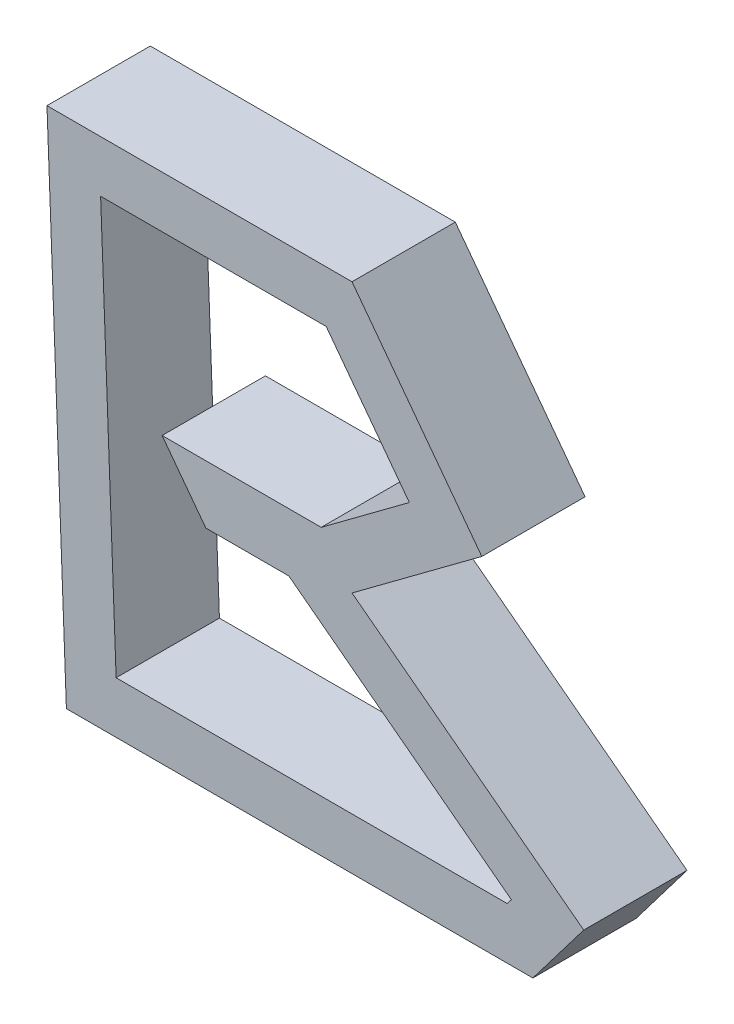
ISO-10303-21;
HEADER;
FILE_DESCRIPTION(('STEP AP214'),'2;1');
FILE_NAME('part.step','',(''),(''),'','','');
FILE_SCHEMA(('AUTOMOTIVE_DESIGN { 1 0 10303 214 1 1 1 1 }'));
ENDSEC;
DATA;
#1=APPLICATION_CONTEXT('core data for automotive mechanical design processes');
#2=APPLICATION_PROTOCOL_DEFINITION('international standard','automotive_design',2000,#1);
#3=PRODUCT_CONTEXT('',#1,'mechanical');
#4=PRODUCT('Part','Part','',(#3));
#5=PRODUCT_RELATED_PRODUCT_CATEGORY('part','',(#4));
#6=PRODUCT_DEFINITION_FORMATION('','',#4);
#7=PRODUCT_DEFINITION_CONTEXT('part definition',#1,'design');
#8=PRODUCT_DEFINITION('design','',#6,#7);
#9=PRODUCT_DEFINITION_SHAPE('','',#8);
#10=(LENGTH_UNIT() NAMED_UNIT(*) SI_UNIT(.MILLI.,.METRE.));
#11=(NAMED_UNIT(*) PLANE_ANGLE_UNIT() SI_UNIT($,.RADIAN.));
#12=(NAMED_UNIT(*) SI_UNIT($,.STERADIAN.) SOLID_ANGLE_UNIT());
#13=UNCERTAINTY_MEASURE_WITH_UNIT(LENGTH_MEASURE(1.E-05),#10,'distance_accuracy_value','');
#14=(GEOMETRIC_REPRESENTATION_CONTEXT(3) GLOBAL_UNCERTAINTY_ASSIGNED_CONTEXT((#13)) GLOBAL_UNIT_ASSIGNED_CONTEXT((#10,
#11,#12)) REPRESENTATION_CONTEXT('',''));
#15=CARTESIAN_POINT('',(0.,0.,0.));
#16=DIRECTION('',(0.,0.,1.));
#17=DIRECTION('',(1.,0.,0.));
#18=AXIS2_PLACEMENT_3D('',#15,#16,#17);
#19=CARTESIAN_POINT('',(-32.5757575757575,-52.9040404040404,20.));
#20=DIRECTION('',(-0.999283369789429,-0.0378516427950544,0.));
#21=DIRECTION('',(0.0378516427950544,-0.999283369789429,0.));
#22=AXIS2_PLACEMENT_3D('',#19,#20,#21);
#23=PLANE('',#22);
#24=DIRECTION('',(-0.0378516427950544,0.999283369789429,0.));
#25=VECTOR('',#24,1.);
#26=CARTESIAN_POINT('',(-32.5757575757575,-52.9040404040404,0.));
#27=LINE('',#26,#25);
#28=CARTESIAN_POINT('',(-32.5757575757575,-52.9040404040404,0.));
#29=VERTEX_POINT('',#28);
#30=CARTESIAN_POINT('',(-36.334940312213,46.3383838383838,0.));
#31=VERTEX_POINT('',#30);
#32=EDGE_CURVE('E221',#29,#31,#27,.T.);
#33=ORIENTED_EDGE('',*,*,#32,.F.);
#34=DIRECTION('',(0.,0.,-1.));
#35=VECTOR('',#34,1.);
#36=CARTESIAN_POINT('',(-32.5757575757575,-52.9040404040404,20.));
#37=LINE('',#36,#35);
#38=CARTESIAN_POINT('',(-32.5757575757575,-52.9040404040404,20.));
#39=VERTEX_POINT('',#38);
#40=EDGE_CURVE('E11',#39,#29,#37,.T.);
#41=ORIENTED_EDGE('',*,*,#40,.F.);
#42=DIRECTION('',(-0.0378516427950544,0.999283369789429,0.));
#43=VECTOR('',#42,1.);
#44=CARTESIAN_POINT('',(-32.5757575757575,-52.9040404040404,20.));
#45=LINE('',#44,#43);
#46=CARTESIAN_POINT('',(-36.334940312213,46.3383838383838,20.));
#47=VERTEX_POINT('',#46);
#48=EDGE_CURVE('E237',#39,#47,#45,.T.);
#49=ORIENTED_EDGE('',*,*,#48,.T.);
#50=DIRECTION('',(0.,0.,-1.));
#51=VECTOR('',#50,1.);
#52=CARTESIAN_POINT('',(-36.334940312213,46.3383838383838,20.));
#53=LINE('',#52,#51);
#54=EDGE_CURVE('E36',#47,#31,#53,.T.);
#55=ORIENTED_EDGE('',*,*,#54,.T.);
#56=EDGE_LOOP('',(#33,#41,#49,#55));
#57=FACE_BOUND('',#56,.T.);
#58=ADVANCED_FACE('F33',(#57),#23,.T.);
#59=CARTESIAN_POINT('',(57.7431652603888,-52.9040404040404,20.));
#60=DIRECTION('',(0.,-1.,0.));
#61=DIRECTION('',(0.,0.,-1.));
#62=AXIS2_PLACEMENT_3D('',#59,#60,#61);
#63=PLANE('',#62);
#64=DIRECTION('',(-1.,0.,0.));
#65=VECTOR('',#64,1.);
#66=CARTESIAN_POINT('',(57.7431652603888,-52.9040404040404,0.));
#67=LINE('',#66,#65);
#68=CARTESIAN_POINT('',(57.7431652603888,-52.9040404040404,0.));
#69=VERTEX_POINT('',#68);
#70=EDGE_CURVE('E241',#69,#29,#67,.T.);
#71=ORIENTED_EDGE('',*,*,#70,.F.);
#72=DIRECTION('',(0.,0.,-1.));
#73=VECTOR('',#72,1.);
#74=CARTESIAN_POINT('',(57.7431652603888,-52.9040404040404,20.));
#75=LINE('',#74,#73);
#76=CARTESIAN_POINT('',(57.7431652603888,-52.9040404040404,20.));
#77=VERTEX_POINT('',#76);
#78=EDGE_CURVE('E41',#77,#69,#75,.T.);
#79=ORIENTED_EDGE('',*,*,#78,.F.);
#80=DIRECTION('',(-1.,0.,0.));
#81=VECTOR('',#80,1.);
#82=CARTESIAN_POINT('',(57.7431652603888,-52.9040404040404,20.));
#83=LINE('',#82,#81);
#84=EDGE_CURVE('E256',#77,#39,#83,.T.);
#85=ORIENTED_EDGE('',*,*,#84,.T.);
#86=ORIENTED_EDGE('',*,*,#40,.T.);
#87=EDGE_LOOP('',(#71,#79,#85,#86));
#88=FACE_BOUND('',#87,.T.);
#89=ADVANCED_FACE('F296',(#88),#63,.T.);
#90=CARTESIAN_POINT('',(67.5927987725935,-39.9413767302657,20.));
#91=DIRECTION('',(0.796221101998587,-0.605005749338099,0.));
#92=DIRECTION('',(0.605005749338099,0.796221101998587,0.));
#93=AXIS2_PLACEMENT_3D('',#90,#91,#92);
#94=PLANE('',#93);
#95=DIRECTION('',(-0.605005749338099,-0.796221101998587,0.));
#96=VECTOR('',#95,1.);
#97=CARTESIAN_POINT('',(67.5927987725935,-39.9413767302657,0.));
#98=LINE('',#97,#96);
#99=CARTESIAN_POINT('',(67.5927987725935,-39.9413767302657,0.));
#100=VERTEX_POINT('',#99);
#101=EDGE_CURVE('E273',#100,#69,#98,.T.);
#102=ORIENTED_EDGE('',*,*,#101,.F.);
#103=DIRECTION('',(0.,0.,-1.));
#104=VECTOR('',#103,1.);
#105=CARTESIAN_POINT('',(67.5927987725935,-39.9413767302657,20.));
#106=LINE('',#105,#104);
#107=CARTESIAN_POINT('',(67.5927987725935,-39.9413767302657,20.));
#108=VERTEX_POINT('',#107);
#109=EDGE_CURVE('E279',#108,#100,#106,.T.);
#110=ORIENTED_EDGE('',*,*,#109,.F.);
#111=DIRECTION('',(-0.605005749338099,-0.796221101998587,0.));
#112=VECTOR('',#111,1.);
#113=CARTESIAN_POINT('',(67.5927987725935,-39.9413767302657,20.));
#114=LINE('',#113,#112);
#115=EDGE_CURVE('E253',#108,#77,#114,.T.);
#116=ORIENTED_EDGE('',*,*,#115,.T.);
#117=ORIENTED_EDGE('',*,*,#78,.T.);
#118=EDGE_LOOP('',(#102,#110,#116,#117));
#119=FACE_BOUND('',#118,.T.);
#120=ADVANCED_FACE('F313',(#119),#94,.T.);
#121=CARTESIAN_POINT('',(22.7272727272728,-5.85046763935663,20.));
#122=DIRECTION('',(0.6050057493381,0.796221101998587,0.));
#123=DIRECTION('',(-0.796221101998587,0.6050057493381,0.));
#124=AXIS2_PLACEMENT_3D('',#121,#122,#123);
#125=PLANE('',#124);
#126=DIRECTION('',(0.796221101998587,-0.6050057493381,0.));
#127=VECTOR('',#126,1.);
#128=CARTESIAN_POINT('',(22.7272727272728,-5.85046763935663,0.));
#129=LINE('',#128,#127);
#130=CARTESIAN_POINT('',(22.7272727272728,-5.85046763935663,0.));
#131=VERTEX_POINT('',#130);
#132=EDGE_CURVE('E270',#131,#100,#129,.T.);
#133=ORIENTED_EDGE('',*,*,#132,.F.);
#134=DIRECTION('',(0.,0.,-1.));
#135=VECTOR('',#134,1.);
#136=CARTESIAN_POINT('',(22.7272727272728,-5.85046763935663,20.));
#137=LINE('',#136,#135);
#138=CARTESIAN_POINT('',(22.7272727272728,-5.85046763935663,20.));
#139=VERTEX_POINT('',#138);
#140=EDGE_CURVE('E281',#139,#131,#137,.T.);
#141=ORIENTED_EDGE('',*,*,#140,.F.);
#142=DIRECTION('',(0.796221101998587,-0.6050057493381,0.));
#143=VECTOR('',#142,1.);
#144=CARTESIAN_POINT('',(22.7272727272728,-5.85046763935663,20.));
#145=LINE('',#144,#143);
#146=EDGE_CURVE('E250',#139,#108,#145,.T.);
#147=ORIENTED_EDGE('',*,*,#146,.T.);
#148=ORIENTED_EDGE('',*,*,#109,.T.);
#149=EDGE_LOOP('',(#133,#141,#147,#148));
#150=FACE_BOUND('',#149,.T.);
#151=ADVANCED_FACE('F311',(#150),#125,.T.);
#152=CARTESIAN_POINT('',(47.8538595656998,12.8362680538144,20.));
#153=DIRECTION('',(0.596761649531636,-0.802418552657079,0.));
#154=DIRECTION('',(0.802418552657079,0.596761649531636,0.));
#155=AXIS2_PLACEMENT_3D('',#152,#153,#154);
#156=PLANE('',#155);
#157=DIRECTION('',(-0.802418552657079,-0.596761649531636,0.));
#158=VECTOR('',#157,1.);
#159=CARTESIAN_POINT('',(47.8538595656998,12.8362680538144,0.));
#160=LINE('',#159,#158);
#161=CARTESIAN_POINT('',(47.8538595656998,12.8362680538144,0.));
#162=VERTEX_POINT('',#161);
#163=EDGE_CURVE('E267',#162,#131,#160,.T.);
#164=ORIENTED_EDGE('',*,*,#163,.F.);
#165=DIRECTION('',(0.,0.,-1.));
#166=VECTOR('',#165,1.);
#167=CARTESIAN_POINT('',(47.8538595656998,12.8362680538144,20.));
#168=LINE('',#167,#166);
#169=CARTESIAN_POINT('',(47.8538595656998,12.8362680538144,20.));
#170=VERTEX_POINT('',#169);
#171=EDGE_CURVE('E283',#170,#162,#168,.T.);
#172=ORIENTED_EDGE('',*,*,#171,.F.);
#173=DIRECTION('',(-0.802418552657079,-0.596761649531636,0.));
#174=VECTOR('',#173,1.);
#175=CARTESIAN_POINT('',(47.8538595656998,12.8362680538144,20.));
#176=LINE('',#175,#174);
#177=EDGE_CURVE('E247',#170,#139,#176,.T.);
#178=ORIENTED_EDGE('',*,*,#177,.T.);
#179=ORIENTED_EDGE('',*,*,#140,.T.);
#180=EDGE_LOOP('',(#164,#172,#178,#179));
#181=FACE_BOUND('',#180,.T.);
#182=ADVANCED_FACE('F309',(#181),#156,.T.);
#183=CARTESIAN_POINT('',(22.7272727272728,46.3383838383838,20.));
#184=DIRECTION('',(0.8,0.6,0.));
#185=DIRECTION('',(-0.6,0.8,0.));
#186=AXIS2_PLACEMENT_3D('',#183,#184,#185);
#187=PLANE('',#186);
#188=DIRECTION('',(0.6,-0.8,0.));
#189=VECTOR('',#188,1.);
#190=CARTESIAN_POINT('',(22.7272727272728,46.3383838383838,0.));
#191=LINE('',#190,#189);
#192=CARTESIAN_POINT('',(22.7272727272728,46.3383838383838,0.));
#193=VERTEX_POINT('',#192);
#194=EDGE_CURVE('E264',#193,#162,#191,.T.);
#195=ORIENTED_EDGE('',*,*,#194,.F.);
#196=DIRECTION('',(0.,0.,-1.));
#197=VECTOR('',#196,1.);
#198=CARTESIAN_POINT('',(22.7272727272728,46.3383838383838,20.));
#199=LINE('',#198,#197);
#200=CARTESIAN_POINT('',(22.7272727272728,46.3383838383838,20.));
#201=VERTEX_POINT('',#200);
#202=EDGE_CURVE('E284',#201,#193,#199,.T.);
#203=ORIENTED_EDGE('',*,*,#202,.F.);
#204=DIRECTION('',(0.6,-0.8,0.));
#205=VECTOR('',#204,1.);
#206=CARTESIAN_POINT('',(22.7272727272728,46.3383838383838,20.));
#207=LINE('',#206,#205);
#208=EDGE_CURVE('E244',#201,#170,#207,.T.);
#209=ORIENTED_EDGE('',*,*,#208,.T.);
#210=ORIENTED_EDGE('',*,*,#171,.T.);
#211=EDGE_LOOP('',(#195,#203,#209,#210));
#212=FACE_BOUND('',#211,.T.);
#213=ADVANCED_FACE('F305',(#212),#187,.T.);
#214=CARTESIAN_POINT('',(-36.334940312213,46.3383838383838,20.));
#215=DIRECTION('',(0.,1.,0.));
#216=DIRECTION('',(0.,0.,1.));
#217=AXIS2_PLACEMENT_3D('',#214,#215,#216);
#218=PLANE('',#217);
#219=DIRECTION('',(1.,0.,0.));
#220=VECTOR('',#219,1.);
#221=CARTESIAN_POINT('',(-36.334940312213,46.3383838383838,0.));
#222=LINE('',#221,#220);
#223=EDGE_CURVE('E261',#31,#193,#222,.T.);
#224=ORIENTED_EDGE('',*,*,#223,.F.);
#225=ORIENTED_EDGE('',*,*,#54,.F.);
#226=DIRECTION('',(1.,0.,0.));
#227=VECTOR('',#226,1.);
#228=CARTESIAN_POINT('',(-36.334940312213,46.3383838383838,20.));
#229=LINE('',#228,#227);
#230=EDGE_CURVE('E240',#47,#201,#229,.T.);
#231=ORIENTED_EDGE('',*,*,#230,.T.);
#232=ORIENTED_EDGE('',*,*,#202,.T.);
#233=EDGE_LOOP('',(#224,#225,#231,#232));
#234=FACE_BOUND('',#233,.T.);
#235=ADVANCED_FACE('F292',(#234),#218,.T.);
#236=CARTESIAN_POINT('',(0.,0.,20.));
#237=DIRECTION('',(0.,0.,-1.));
#238=DIRECTION('',(-1.,0.,0.));
#239=AXIS2_PLACEMENT_3D('',#236,#237,#238);
#240=PLANE('',#239);
#241=DIRECTION('',(1.,0.,0.));
#242=VECTOR('',#241,1.);
#243=CARTESIAN_POINT('',(-14.0418297453736,2.17371788721415,20.));
#244=LINE('',#243,#242);
#245=CARTESIAN_POINT('',(-14.0418297453736,2.17371788721415,20.));
#246=VERTEX_POINT('',#245);
#247=CARTESIAN_POINT('',(16.7596562319564,2.17371788721415,20.));
#248=VERTEX_POINT('',#247);
#249=EDGE_CURVE('E197',#246,#248,#244,.T.);
#250=ORIENTED_EDGE('',*,*,#249,.F.);
#251=DIRECTION('',(-0.599999999999999,0.800000000000001,0.));
#252=VECTOR('',#251,1.);
#253=CARTESIAN_POINT('',(-5.57568930124833,-9.11446937161957,20.));
#254=LINE('',#253,#252);
#255=CARTESIAN_POINT('',(-5.57568930124833,-9.11446937161957,20.));
#256=VERTEX_POINT('',#255);
#257=EDGE_CURVE('E49',#256,#246,#254,.T.);
#258=ORIENTED_EDGE('',*,*,#257,.F.);
#259=DIRECTION('',(-1.,0.,0.));
#260=VECTOR('',#259,1.);
#261=CARTESIAN_POINT('',(10.4941113863939,-9.11446937161957,20.));
#262=LINE('',#261,#260);
#263=CARTESIAN_POINT('',(10.4941113863939,-9.11446937161957,20.));
#264=VERTEX_POINT('',#263);
#265=EDGE_CURVE('E171',#264,#256,#262,.T.);
#266=ORIENTED_EDGE('',*,*,#265,.F.);
#267=DIRECTION('',(-0.796221101998587,0.6050057493381,0.));
#268=VECTOR('',#267,1.);
#269=CARTESIAN_POINT('',(10.4941113863939,-9.11446937161957,20.));
#270=LINE('',#269,#268);
#271=CARTESIAN_POINT('',(53.5805302592266,-41.8535302568706,20.));
#272=VERTEX_POINT('',#271);
#273=EDGE_CURVE('E174',#272,#264,#270,.T.);
#274=ORIENTED_EDGE('',*,*,#273,.F.);
#275=DIRECTION('',(0.605005749338099,0.796221101998588,0.));
#276=VECTOR('',#275,1.);
#277=CARTESIAN_POINT('',(53.5805302592266,-41.8535302568706,20.));
#278=LINE('',#277,#276);
#279=CARTESIAN_POINT('',(52.7823038907211,-42.9040404040404,20.));
#280=VERTEX_POINT('',#279);
#281=EDGE_CURVE('E214',#280,#272,#278,.T.);
#282=ORIENTED_EDGE('',*,*,#281,.F.);
#283=DIRECTION('',(1.,0.,0.));
#284=VECTOR('',#283,1.);
#285=CARTESIAN_POINT('',(52.7823038907211,-42.9040404040404,20.));
#286=LINE('',#285,#284);
#287=CARTESIAN_POINT('',(-22.9473740131682,-42.9040404040404,20.));
#288=VERTEX_POINT('',#287);
#289=EDGE_CURVE('E211',#288,#280,#286,.T.);
#290=ORIENTED_EDGE('',*,*,#289,.F.);
#291=DIRECTION('',(0.0378516427950544,-0.999283369789428,0.));
#292=VECTOR('',#291,1.);
#293=CARTESIAN_POINT('',(-22.9473740131682,-42.9040404040404,20.));
#294=LINE('',#293,#292);
#295=CARTESIAN_POINT('',(-25.9489809920479,36.3383838383838,20.));
#296=VERTEX_POINT('',#295);
#297=EDGE_CURVE('E208',#296,#288,#294,.T.);
#298=ORIENTED_EDGE('',*,*,#297,.F.);
#299=DIRECTION('',(-1.,0.,0.));
#300=VECTOR('',#299,1.);
#301=CARTESIAN_POINT('',(-25.9489809920479,36.3383838383838,20.));
#302=LINE('',#301,#300);
#303=CARTESIAN_POINT('',(17.7272727272728,36.3383838383838,20.));
#304=VERTEX_POINT('',#303);
#305=EDGE_CURVE('E205',#304,#296,#302,.T.);
#306=ORIENTED_EDGE('',*,*,#305,.F.);
#307=DIRECTION('',(-0.599999999999999,0.8,0.));
#308=VECTOR('',#307,1.);
#309=CARTESIAN_POINT('',(17.7272727272728,36.3383838383838,20.));
#310=LINE('',#309,#308);
#311=CARTESIAN_POINT('',(33.8295594864673,14.8686681594578,20.));
#312=VERTEX_POINT('',#311);
#313=EDGE_CURVE('E202',#312,#304,#310,.T.);
#314=ORIENTED_EDGE('',*,*,#313,.F.);
#315=DIRECTION('',(0.802418552657078,0.596761649531636,0.));
#316=VECTOR('',#315,1.);
#317=CARTESIAN_POINT('',(33.8295594864673,14.8686681594578,20.));
#318=LINE('',#317,#316);
#319=EDGE_CURVE('E199',#248,#312,#318,.T.);
#320=ORIENTED_EDGE('',*,*,#319,.F.);
#321=EDGE_LOOP('',(#250,#258,#266,#274,#282,#290,#298,#306,#314,#320));
#322=FACE_BOUND('',#321,.T.);
#323=ORIENTED_EDGE('',*,*,#48,.F.);
#324=ORIENTED_EDGE('',*,*,#84,.F.);
#325=ORIENTED_EDGE('',*,*,#115,.F.);
#326=ORIENTED_EDGE('',*,*,#146,.F.);
#327=ORIENTED_EDGE('',*,*,#177,.F.);
#328=ORIENTED_EDGE('',*,*,#208,.F.);
#329=ORIENTED_EDGE('',*,*,#230,.F.);
#330=EDGE_LOOP('',(#323,#324,#325,#326,#327,#328,#329));
#331=FACE_BOUND('',#330,.T.);
#332=ADVANCED_FACE('F299',(#322,#331),#240,.F.);
#333=CARTESIAN_POINT('',(0.,0.,0.));
#334=DIRECTION('',(0.,0.,-1.));
#335=DIRECTION('',(-1.,0.,0.));
#336=AXIS2_PLACEMENT_3D('',#333,#334,#335);
#337=PLANE('',#336);
#338=DIRECTION('',(-0.599999999999999,0.800000000000001,0.));
#339=VECTOR('',#338,1.);
#340=CARTESIAN_POINT('',(-5.57568930124833,-9.11446937161957,0.));
#341=LINE('',#340,#339);
#342=CARTESIAN_POINT('',(-5.57568930124833,-9.11446937161957,0.));
#343=VERTEX_POINT('',#342);
#344=CARTESIAN_POINT('',(-14.0418297453736,2.17371788721415,0.));
#345=VERTEX_POINT('',#344);
#346=EDGE_CURVE('E154',#343,#345,#341,.T.);
#347=ORIENTED_EDGE('',*,*,#346,.T.);
#348=DIRECTION('',(1.,0.,0.));
#349=VECTOR('',#348,1.);
#350=CARTESIAN_POINT('',(-14.0418297453736,2.17371788721415,0.));
#351=LINE('',#350,#349);
#352=CARTESIAN_POINT('',(16.7596562319564,2.17371788721415,0.));
#353=VERTEX_POINT('',#352);
#354=EDGE_CURVE('E163',#345,#353,#351,.T.);
#355=ORIENTED_EDGE('',*,*,#354,.T.);
#356=DIRECTION('',(0.802418552657078,0.596761649531636,0.));
#357=VECTOR('',#356,1.);
#358=CARTESIAN_POINT('',(33.8295594864673,14.8686681594578,0.));
#359=LINE('',#358,#357);
#360=CARTESIAN_POINT('',(33.8295594864673,14.8686681594578,0.));
#361=VERTEX_POINT('',#360);
#362=EDGE_CURVE('E57',#353,#361,#359,.T.);
#363=ORIENTED_EDGE('',*,*,#362,.T.);
#364=DIRECTION('',(-0.599999999999999,0.8,0.));
#365=VECTOR('',#364,1.);
#366=CARTESIAN_POINT('',(17.7272727272728,36.3383838383838,0.));
#367=LINE('',#366,#365);
#368=CARTESIAN_POINT('',(17.7272727272728,36.3383838383838,0.));
#369=VERTEX_POINT('',#368);
#370=EDGE_CURVE('E178',#361,#369,#367,.T.);
#371=ORIENTED_EDGE('',*,*,#370,.T.);
#372=DIRECTION('',(-1.,0.,0.));
#373=VECTOR('',#372,1.);
#374=CARTESIAN_POINT('',(-25.9489809920479,36.3383838383838,0.));
#375=LINE('',#374,#373);
#376=CARTESIAN_POINT('',(-25.9489809920479,36.3383838383838,0.));
#377=VERTEX_POINT('',#376);
#378=EDGE_CURVE('E181',#369,#377,#375,.T.);
#379=ORIENTED_EDGE('',*,*,#378,.T.);
#380=DIRECTION('',(0.0378516427950544,-0.999283369789428,0.));
#381=VECTOR('',#380,1.);
#382=CARTESIAN_POINT('',(-22.9473740131682,-42.9040404040404,0.));
#383=LINE('',#382,#381);
#384=CARTESIAN_POINT('',(-22.9473740131682,-42.9040404040404,0.));
#385=VERTEX_POINT('',#384);
#386=EDGE_CURVE('E184',#377,#385,#383,.T.);
#387=ORIENTED_EDGE('',*,*,#386,.T.);
#388=DIRECTION('',(1.,0.,0.));
#389=VECTOR('',#388,1.);
#390=CARTESIAN_POINT('',(52.7823038907211,-42.9040404040404,0.));
#391=LINE('',#390,#389);
#392=CARTESIAN_POINT('',(52.7823038907211,-42.9040404040404,0.));
#393=VERTEX_POINT('',#392);
#394=EDGE_CURVE('E187',#385,#393,#391,.T.);
#395=ORIENTED_EDGE('',*,*,#394,.T.);
#396=DIRECTION('',(0.605005749338099,0.796221101998588,0.));
#397=VECTOR('',#396,1.);
#398=CARTESIAN_POINT('',(53.5805302592266,-41.8535302568706,0.));
#399=LINE('',#398,#397);
#400=CARTESIAN_POINT('',(53.5805302592266,-41.8535302568706,0.));
#401=VERTEX_POINT('',#400);
#402=EDGE_CURVE('E190',#393,#401,#399,.T.);
#403=ORIENTED_EDGE('',*,*,#402,.T.);
#404=DIRECTION('',(-0.796221101998587,0.6050057493381,0.));
#405=VECTOR('',#404,1.);
#406=CARTESIAN_POINT('',(10.4941113863939,-9.11446937161957,0.));
#407=LINE('',#406,#405);
#408=CARTESIAN_POINT('',(10.4941113863939,-9.11446937161957,0.));
#409=VERTEX_POINT('',#408);
#410=EDGE_CURVE('E193',#401,#409,#407,.T.);
#411=ORIENTED_EDGE('',*,*,#410,.T.);
#412=DIRECTION('',(-1.,0.,0.));
#413=VECTOR('',#412,1.);
#414=CARTESIAN_POINT('',(10.4941113863939,-9.11446937161957,0.));
#415=LINE('',#414,#413);
#416=EDGE_CURVE('E160',#409,#343,#415,.T.);
#417=ORIENTED_EDGE('',*,*,#416,.T.);
#418=EDGE_LOOP('',(#347,#355,#363,#371,#379,#387,#395,#403,#411,#417));
#419=FACE_BOUND('',#418,.T.);
#420=ORIENTED_EDGE('',*,*,#32,.T.);
#421=ORIENTED_EDGE('',*,*,#223,.T.);
#422=ORIENTED_EDGE('',*,*,#194,.T.);
#423=ORIENTED_EDGE('',*,*,#163,.T.);
#424=ORIENTED_EDGE('',*,*,#132,.T.);
#425=ORIENTED_EDGE('',*,*,#101,.T.);
#426=ORIENTED_EDGE('',*,*,#70,.T.);
#427=EDGE_LOOP('',(#420,#421,#422,#423,#424,#425,#426));
#428=FACE_BOUND('',#427,.T.);
#429=ADVANCED_FACE('F167',(#419,#428),#337,.T.);
#430=CARTESIAN_POINT('',(-5.57568930124833,-9.11446937161957,0.));
#431=DIRECTION('',(0.8,0.599999999999999,0.));
#432=DIRECTION('',(-0.599999999999999,0.8,0.));
#433=AXIS2_PLACEMENT_3D('',#430,#431,#432);
#434=PLANE('',#433);
#435=ORIENTED_EDGE('',*,*,#257,.T.);
#436=DIRECTION('',(0.,0.,1.));
#437=VECTOR('',#436,1.);
#438=CARTESIAN_POINT('',(-14.0418297453736,2.17371788721415,0.));
#439=LINE('',#438,#437);
#440=EDGE_CURVE('E150',#345,#246,#439,.T.);
#441=ORIENTED_EDGE('',*,*,#440,.F.);
#442=ORIENTED_EDGE('',*,*,#346,.F.);
#443=DIRECTION('',(0.,0.,1.));
#444=VECTOR('',#443,1.);
#445=CARTESIAN_POINT('',(-5.57568930124833,-9.11446937161957,0.));
#446=LINE('',#445,#444);
#447=EDGE_CURVE('E219',#343,#256,#446,.T.);
#448=ORIENTED_EDGE('',*,*,#447,.T.);
#449=EDGE_LOOP('',(#435,#441,#442,#448));
#450=FACE_BOUND('',#449,.T.);
#451=ADVANCED_FACE('F152',(#450),#434,.F.);
#452=CARTESIAN_POINT('',(10.4941113863939,-9.11446937161957,0.));
#453=DIRECTION('',(0.,1.,0.));
#454=DIRECTION('',(0.,0.,1.));
#455=AXIS2_PLACEMENT_3D('',#452,#453,#454);
#456=PLANE('',#455);
#457=ORIENTED_EDGE('',*,*,#265,.T.);
#458=ORIENTED_EDGE('',*,*,#447,.F.);
#459=ORIENTED_EDGE('',*,*,#416,.F.);
#460=DIRECTION('',(0.,0.,1.));
#461=VECTOR('',#460,1.);
#462=CARTESIAN_POINT('',(10.4941113863939,-9.11446937161957,0.));
#463=LINE('',#462,#461);
#464=EDGE_CURVE('E222',#409,#264,#463,.T.);
#465=ORIENTED_EDGE('',*,*,#464,.T.);
#466=EDGE_LOOP('',(#457,#458,#459,#465));
#467=FACE_BOUND('',#466,.T.);
#468=ADVANCED_FACE('F388',(#467),#456,.F.);
#469=CARTESIAN_POINT('',(10.4941113863939,-9.11446937161957,0.));
#470=DIRECTION('',(0.6050057493381,0.796221101998587,0.));
#471=DIRECTION('',(-0.796221101998587,0.6050057493381,0.));
#472=AXIS2_PLACEMENT_3D('',#469,#470,#471);
#473=PLANE('',#472);
#474=ORIENTED_EDGE('',*,*,#273,.T.);
#475=ORIENTED_EDGE('',*,*,#464,.F.);
#476=ORIENTED_EDGE('',*,*,#410,.F.);
#477=DIRECTION('',(0.,0.,1.));
#478=VECTOR('',#477,1.);
#479=CARTESIAN_POINT('',(53.5805302592266,-41.8535302568706,0.));
#480=LINE('',#479,#478);
#481=EDGE_CURVE('E224',#401,#272,#480,.T.);
#482=ORIENTED_EDGE('',*,*,#481,.T.);
#483=EDGE_LOOP('',(#474,#475,#476,#482));
#484=FACE_BOUND('',#483,.T.);
#485=ADVANCED_FACE('F397',(#484),#473,.F.);
#486=CARTESIAN_POINT('',(53.5805302592266,-41.8535302568706,0.));
#487=DIRECTION('',(0.796221101998588,-0.605005749338099,0.));
#488=DIRECTION('',(0.605005749338099,0.796221101998588,0.));
#489=AXIS2_PLACEMENT_3D('',#486,#487,#488);
#490=PLANE('',#489);
#491=ORIENTED_EDGE('',*,*,#281,.T.);
#492=ORIENTED_EDGE('',*,*,#481,.F.);
#493=ORIENTED_EDGE('',*,*,#402,.F.);
#494=DIRECTION('',(0.,0.,1.));
#495=VECTOR('',#494,1.);
#496=CARTESIAN_POINT('',(52.7823038907211,-42.9040404040404,0.));
#497=LINE('',#496,#495);
#498=EDGE_CURVE('E226',#393,#280,#497,.T.);
#499=ORIENTED_EDGE('',*,*,#498,.T.);
#500=EDGE_LOOP('',(#491,#492,#493,#499));
#501=FACE_BOUND('',#500,.T.);
#502=ADVANCED_FACE('F407',(#501),#490,.F.);
#503=CARTESIAN_POINT('',(52.7823038907211,-42.9040404040404,0.));
#504=DIRECTION('',(0.,-1.,0.));
#505=DIRECTION('',(0.,0.,-1.));
#506=AXIS2_PLACEMENT_3D('',#503,#504,#505);
#507=PLANE('',#506);
#508=ORIENTED_EDGE('',*,*,#289,.T.);
#509=ORIENTED_EDGE('',*,*,#498,.F.);
#510=ORIENTED_EDGE('',*,*,#394,.F.);
#511=DIRECTION('',(0.,0.,1.));
#512=VECTOR('',#511,1.);
#513=CARTESIAN_POINT('',(-22.9473740131682,-42.9040404040404,0.));
#514=LINE('',#513,#512);
#515=EDGE_CURVE('E228',#385,#288,#514,.T.);
#516=ORIENTED_EDGE('',*,*,#515,.T.);
#517=EDGE_LOOP('',(#508,#509,#510,#516));
#518=FACE_BOUND('',#517,.T.);
#519=ADVANCED_FACE('F417',(#518),#507,.F.);
#520=CARTESIAN_POINT('',(-22.9473740131682,-42.9040404040404,0.));
#521=DIRECTION('',(-0.999283369789429,-0.0378516427950544,0.));
#522=DIRECTION('',(0.0378516427950544,-0.999283369789429,0.));
#523=AXIS2_PLACEMENT_3D('',#520,#521,#522);
#524=PLANE('',#523);
#525=ORIENTED_EDGE('',*,*,#297,.T.);
#526=ORIENTED_EDGE('',*,*,#515,.F.);
#527=ORIENTED_EDGE('',*,*,#386,.F.);
#528=DIRECTION('',(0.,0.,1.));
#529=VECTOR('',#528,1.);
#530=CARTESIAN_POINT('',(-25.9489809920479,36.3383838383838,0.));
#531=LINE('',#530,#529);
#532=EDGE_CURVE('E230',#377,#296,#531,.T.);
#533=ORIENTED_EDGE('',*,*,#532,.T.);
#534=EDGE_LOOP('',(#525,#526,#527,#533));
#535=FACE_BOUND('',#534,.T.);
#536=ADVANCED_FACE('F427',(#535),#524,.F.);
#537=CARTESIAN_POINT('',(-25.9489809920479,36.3383838383838,0.));
#538=DIRECTION('',(0.,1.,0.));
#539=DIRECTION('',(0.,0.,1.));
#540=AXIS2_PLACEMENT_3D('',#537,#538,#539);
#541=PLANE('',#540);
#542=ORIENTED_EDGE('',*,*,#305,.T.);
#543=ORIENTED_EDGE('',*,*,#532,.F.);
#544=ORIENTED_EDGE('',*,*,#378,.F.);
#545=DIRECTION('',(0.,0.,1.));
#546=VECTOR('',#545,1.);
#547=CARTESIAN_POINT('',(17.7272727272728,36.3383838383838,0.));
#548=LINE('',#547,#546);
#549=EDGE_CURVE('E232',#369,#304,#548,.T.);
#550=ORIENTED_EDGE('',*,*,#549,.T.);
#551=EDGE_LOOP('',(#542,#543,#544,#550));
#552=FACE_BOUND('',#551,.T.);
#553=ADVANCED_FACE('F437',(#552),#541,.F.);
#554=CARTESIAN_POINT('',(17.7272727272728,36.3383838383838,0.));
#555=DIRECTION('',(0.8,0.599999999999999,0.));
#556=DIRECTION('',(-0.599999999999999,0.800000000000001,0.));
#557=AXIS2_PLACEMENT_3D('',#554,#555,#556);
#558=PLANE('',#557);
#559=ORIENTED_EDGE('',*,*,#313,.T.);
#560=ORIENTED_EDGE('',*,*,#549,.F.);
#561=ORIENTED_EDGE('',*,*,#370,.F.);
#562=DIRECTION('',(0.,0.,1.));
#563=VECTOR('',#562,1.);
#564=CARTESIAN_POINT('',(33.8295594864673,14.8686681594578,0.));
#565=LINE('',#564,#563);
#566=EDGE_CURVE('E234',#361,#312,#565,.T.);
#567=ORIENTED_EDGE('',*,*,#566,.T.);
#568=EDGE_LOOP('',(#559,#560,#561,#567));
#569=FACE_BOUND('',#568,.T.);
#570=ADVANCED_FACE('F447',(#569),#558,.F.);
#571=CARTESIAN_POINT('',(33.8295594864673,14.8686681594578,0.));
#572=DIRECTION('',(0.596761649531636,-0.802418552657079,0.));
#573=DIRECTION('',(0.802418552657079,0.596761649531636,0.));
#574=AXIS2_PLACEMENT_3D('',#571,#572,#573);
#575=PLANE('',#574);
#576=ORIENTED_EDGE('',*,*,#319,.T.);
#577=ORIENTED_EDGE('',*,*,#566,.F.);
#578=ORIENTED_EDGE('',*,*,#362,.F.);
#579=DIRECTION('',(0.,0.,1.));
#580=VECTOR('',#579,1.);
#581=CARTESIAN_POINT('',(16.7596562319564,2.17371788721415,0.));
#582=LINE('',#581,#580);
#583=EDGE_CURVE('E159',#353,#248,#582,.T.);
#584=ORIENTED_EDGE('',*,*,#583,.T.);
#585=EDGE_LOOP('',(#576,#577,#578,#584));
#586=FACE_BOUND('',#585,.T.);
#587=ADVANCED_FACE('F457',(#586),#575,.F.);
#588=CARTESIAN_POINT('',(-14.0418297453736,2.17371788721415,0.));
#589=DIRECTION('',(0.,-1.,0.));
#590=DIRECTION('',(0.,0.,-1.));
#591=AXIS2_PLACEMENT_3D('',#588,#589,#590);
#592=PLANE('',#591);
#593=ORIENTED_EDGE('',*,*,#249,.T.);
#594=ORIENTED_EDGE('',*,*,#583,.F.);
#595=ORIENTED_EDGE('',*,*,#354,.F.);
#596=ORIENTED_EDGE('',*,*,#440,.T.);
#597=EDGE_LOOP('',(#593,#594,#595,#596));
#598=FACE_BOUND('',#597,.T.);
#599=ADVANCED_FACE('F164',(#598),#592,.F.);
#600=CLOSED_SHELL('',(#58,#89,#120,#151,#182,#213,#235,#332,#429,#451,#468,#485,#502,#519,#536,
#553,#570,#587,#599));
#601=MANIFOLD_SOLID_BREP('B2',#600);
#602=ADVANCED_BREP_SHAPE_REPRESENTATION('',(#18,#601),#14);
#603=SHAPE_DEFINITION_REPRESENTATION(#9,#602);
ENDSEC;
END-ISO-10303-21;
